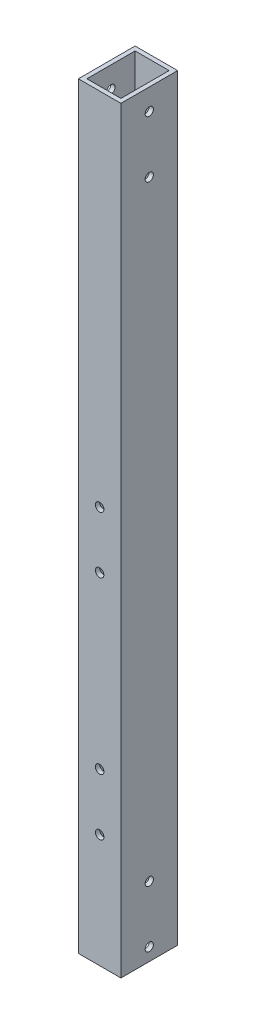
ISO-10303-21;
HEADER;
FILE_DESCRIPTION(('STEP AP214'),'2;1');
FILE_NAME('part.step','',(''),(''),'','','');
FILE_SCHEMA(('AUTOMOTIVE_DESIGN { 1 0 10303 214 1 1 1 1 }'));
ENDSEC;
DATA;
#1=APPLICATION_CONTEXT('core data for automotive mechanical design processes');
#2=APPLICATION_PROTOCOL_DEFINITION('international standard','automotive_design',2000,#1);
#3=PRODUCT_CONTEXT('',#1,'mechanical');
#4=PRODUCT('Part','Part','',(#3));
#5=PRODUCT_RELATED_PRODUCT_CATEGORY('part','',(#4));
#6=PRODUCT_DEFINITION_FORMATION('','',#4);
#7=PRODUCT_DEFINITION_CONTEXT('part definition',#1,'design');
#8=PRODUCT_DEFINITION('design','',#6,#7);
#9=PRODUCT_DEFINITION_SHAPE('','',#8);
#10=(LENGTH_UNIT() NAMED_UNIT(*) SI_UNIT(.MILLI.,.METRE.));
#11=(NAMED_UNIT(*) PLANE_ANGLE_UNIT() SI_UNIT($,.RADIAN.));
#12=(NAMED_UNIT(*) SI_UNIT($,.STERADIAN.) SOLID_ANGLE_UNIT());
#13=UNCERTAINTY_MEASURE_WITH_UNIT(LENGTH_MEASURE(1.E-05),#10,'distance_accuracy_value','');
#14=(GEOMETRIC_REPRESENTATION_CONTEXT(3) GLOBAL_UNCERTAINTY_ASSIGNED_CONTEXT((#13)) GLOBAL_UNIT_ASSIGNED_CONTEXT((#10,
#11,#12)) REPRESENTATION_CONTEXT('',''));
#15=CARTESIAN_POINT('',(0.,0.,0.));
#16=DIRECTION('',(0.,0.,1.));
#17=DIRECTION('',(1.,0.,0.));
#18=AXIS2_PLACEMENT_3D('',#15,#16,#17);
#19=CARTESIAN_POINT('',(0.,267.,0.));
#20=DIRECTION('',(0.,1.,0.));
#21=DIRECTION('',(0.,0.,1.));
#22=AXIS2_PLACEMENT_3D('',#19,#20,#21);
#23=PLANE('',#22);
#24=DIRECTION('',(0.,0.,-1.));
#25=VECTOR('',#24,1.);
#26=CARTESIAN_POINT('',(7.5,267.,10.));
#27=LINE('',#26,#25);
#28=CARTESIAN_POINT('',(7.5,267.,10.));
#29=VERTEX_POINT('',#28);
#30=CARTESIAN_POINT('',(7.5,267.,-10.));
#31=VERTEX_POINT('',#30);
#32=EDGE_CURVE('E172',#29,#31,#27,.T.);
#33=ORIENTED_EDGE('',*,*,#32,.T.);
#34=DIRECTION('',(-1.,0.,0.));
#35=VECTOR('',#34,1.);
#36=CARTESIAN_POINT('',(-7.5,267.,-10.));
#37=LINE('',#36,#35);
#38=CARTESIAN_POINT('',(-7.5,267.,-10.));
#39=VERTEX_POINT('',#38);
#40=EDGE_CURVE('E175',#31,#39,#37,.T.);
#41=ORIENTED_EDGE('',*,*,#40,.T.);
#42=DIRECTION('',(0.,0.,1.));
#43=VECTOR('',#42,1.);
#44=CARTESIAN_POINT('',(-7.5,267.,10.));
#45=LINE('',#44,#43);
#46=CARTESIAN_POINT('',(-7.5,267.,10.));
#47=VERTEX_POINT('',#46);
#48=EDGE_CURVE('E178',#39,#47,#45,.T.);
#49=ORIENTED_EDGE('',*,*,#48,.T.);
#50=DIRECTION('',(1.,0.,0.));
#51=VECTOR('',#50,1.);
#52=CARTESIAN_POINT('',(-7.5,267.,10.));
#53=LINE('',#52,#51);
#54=EDGE_CURVE('E180',#47,#29,#53,.T.);
#55=ORIENTED_EDGE('',*,*,#54,.T.);
#56=EDGE_LOOP('',(#33,#41,#49,#55));
#57=FACE_BOUND('',#56,.T.);
#58=DIRECTION('',(-1.,0.,0.));
#59=VECTOR('',#58,1.);
#60=CARTESIAN_POINT('',(0.,267.,-8.5));
#61=LINE('',#60,#59);
#62=CARTESIAN_POINT('',(6.,267.,-8.5));
#63=VERTEX_POINT('',#62);
#64=CARTESIAN_POINT('',(-6.,267.,-8.5));
#65=VERTEX_POINT('',#64);
#66=EDGE_CURVE('E142',#63,#65,#61,.T.);
#67=ORIENTED_EDGE('',*,*,#66,.F.);
#68=DIRECTION('',(0.,0.,-1.));
#69=VECTOR('',#68,1.);
#70=CARTESIAN_POINT('',(6.,267.,0.));
#71=LINE('',#70,#69);
#72=CARTESIAN_POINT('',(6.,267.,8.5));
#73=VERTEX_POINT('',#72);
#74=EDGE_CURVE('E134',#73,#63,#71,.T.);
#75=ORIENTED_EDGE('',*,*,#74,.F.);
#76=DIRECTION('',(1.,0.,0.));
#77=VECTOR('',#76,1.);
#78=CARTESIAN_POINT('',(0.,267.,8.5));
#79=LINE('',#78,#77);
#80=CARTESIAN_POINT('',(-6.,267.,8.5));
#81=VERTEX_POINT('',#80);
#82=EDGE_CURVE('E156',#81,#73,#79,.T.);
#83=ORIENTED_EDGE('',*,*,#82,.F.);
#84=DIRECTION('',(0.,0.,1.));
#85=VECTOR('',#84,1.);
#86=CARTESIAN_POINT('',(-6.,267.,0.));
#87=LINE('',#86,#85);
#88=EDGE_CURVE('E154',#65,#81,#87,.T.);
#89=ORIENTED_EDGE('',*,*,#88,.F.);
#90=EDGE_LOOP('',(#67,#75,#83,#89));
#91=FACE_BOUND('',#90,.T.);
#92=ADVANCED_FACE('F67',(#57,#91),#23,.T.);
#93=CARTESIAN_POINT('',(0.,0.,0.));
#94=DIRECTION('',(0.,1.,0.));
#95=DIRECTION('',(0.,0.,1.));
#96=AXIS2_PLACEMENT_3D('',#93,#94,#95);
#97=PLANE('',#96);
#98=DIRECTION('',(0.,0.,-1.));
#99=VECTOR('',#98,1.);
#100=CARTESIAN_POINT('',(7.5,0.,10.));
#101=LINE('',#100,#99);
#102=CARTESIAN_POINT('',(7.5,0.,10.));
#103=VERTEX_POINT('',#102);
#104=CARTESIAN_POINT('',(7.5,0.,-10.));
#105=VERTEX_POINT('',#104);
#106=EDGE_CURVE('E150',#103,#105,#101,.T.);
#107=ORIENTED_EDGE('',*,*,#106,.F.);
#108=DIRECTION('',(1.,0.,0.));
#109=VECTOR('',#108,1.);
#110=CARTESIAN_POINT('',(-7.5,0.,10.));
#111=LINE('',#110,#109);
#112=CARTESIAN_POINT('',(-7.5,0.,10.));
#113=VERTEX_POINT('',#112);
#114=EDGE_CURVE('E176',#113,#103,#111,.T.);
#115=ORIENTED_EDGE('',*,*,#114,.F.);
#116=DIRECTION('',(0.,0.,1.));
#117=VECTOR('',#116,1.);
#118=CARTESIAN_POINT('',(-7.5,0.,10.));
#119=LINE('',#118,#117);
#120=CARTESIAN_POINT('',(-7.5,0.,-10.));
#121=VERTEX_POINT('',#120);
#122=EDGE_CURVE('E187',#121,#113,#119,.T.);
#123=ORIENTED_EDGE('',*,*,#122,.F.);
#124=DIRECTION('',(-1.,0.,0.));
#125=VECTOR('',#124,1.);
#126=CARTESIAN_POINT('',(-7.5,0.,-10.));
#127=LINE('',#126,#125);
#128=EDGE_CURVE('E185',#105,#121,#127,.T.);
#129=ORIENTED_EDGE('',*,*,#128,.F.);
#130=EDGE_LOOP('',(#107,#115,#123,#129));
#131=FACE_BOUND('',#130,.T.);
#132=DIRECTION('',(0.,0.,-1.));
#133=VECTOR('',#132,1.);
#134=CARTESIAN_POINT('',(6.,0.,0.));
#135=LINE('',#134,#133);
#136=CARTESIAN_POINT('',(6.,0.,8.5));
#137=VERTEX_POINT('',#136);
#138=CARTESIAN_POINT('',(6.,0.,-8.5));
#139=VERTEX_POINT('',#138);
#140=EDGE_CURVE('E92',#137,#139,#135,.T.);
#141=ORIENTED_EDGE('',*,*,#140,.T.);
#142=DIRECTION('',(-1.,0.,0.));
#143=VECTOR('',#142,1.);
#144=CARTESIAN_POINT('',(0.,0.,-8.5));
#145=LINE('',#144,#143);
#146=CARTESIAN_POINT('',(-6.,0.,-8.5));
#147=VERTEX_POINT('',#146);
#148=EDGE_CURVE('E149',#139,#147,#145,.T.);
#149=ORIENTED_EDGE('',*,*,#148,.T.);
#150=DIRECTION('',(0.,0.,1.));
#151=VECTOR('',#150,1.);
#152=CARTESIAN_POINT('',(-6.,0.,0.));
#153=LINE('',#152,#151);
#154=CARTESIAN_POINT('',(-6.,0.,8.5));
#155=VERTEX_POINT('',#154);
#156=EDGE_CURVE('E164',#147,#155,#153,.T.);
#157=ORIENTED_EDGE('',*,*,#156,.T.);
#158=DIRECTION('',(1.,0.,0.));
#159=VECTOR('',#158,1.);
#160=CARTESIAN_POINT('',(0.,0.,8.5));
#161=LINE('',#160,#159);
#162=EDGE_CURVE('E143',#155,#137,#161,.T.);
#163=ORIENTED_EDGE('',*,*,#162,.T.);
#164=EDGE_LOOP('',(#141,#149,#157,#163));
#165=FACE_BOUND('',#164,.T.);
#166=ADVANCED_FACE('F294',(#131,#165),#97,.F.);
#167=CARTESIAN_POINT('',(7.5,267.,10.));
#168=DIRECTION('',(-1.,0.,0.));
#169=DIRECTION('',(0.,0.,1.));
#170=AXIS2_PLACEMENT_3D('',#167,#168,#169);
#171=PLANE('',#170);
#172=CARTESIAN_POINT('',(7.5,259.5,0.));
#173=DIRECTION('',(1.,0.,0.));
#174=DIRECTION('',(0.,0.,-1.));
#175=AXIS2_PLACEMENT_3D('',#172,#173,#174);
#176=CIRCLE('',#175,1.44999999999999);
#177=CARTESIAN_POINT('',(7.5,259.5,-1.44999999999999));
#178=VERTEX_POINT('',#177);
#179=EDGE_CURVE('E241',#178,#178,#176,.T.);
#180=ORIENTED_EDGE('',*,*,#179,.F.);
#181=EDGE_LOOP('',(#180));
#182=FACE_BOUND('',#181,.T.);
#183=CARTESIAN_POINT('',(7.5,239.5,0.));
#184=DIRECTION('',(1.,0.,0.));
#185=DIRECTION('',(0.,0.,-1.));
#186=AXIS2_PLACEMENT_3D('',#183,#184,#185);
#187=CIRCLE('',#186,1.45);
#188=CARTESIAN_POINT('',(7.5,239.5,-1.45));
#189=VERTEX_POINT('',#188);
#190=EDGE_CURVE('E244',#189,#189,#187,.T.);
#191=ORIENTED_EDGE('',*,*,#190,.F.);
#192=EDGE_LOOP('',(#191));
#193=FACE_BOUND('',#192,.T.);
#194=CARTESIAN_POINT('',(7.5,24.5,0.));
#195=DIRECTION('',(1.,0.,0.));
#196=DIRECTION('',(0.,0.,-1.));
#197=AXIS2_PLACEMENT_3D('',#194,#195,#196);
#198=CIRCLE('',#197,1.45);
#199=CARTESIAN_POINT('',(7.5,24.5,-1.45));
#200=VERTEX_POINT('',#199);
#201=EDGE_CURVE('E250',#200,#200,#198,.T.);
#202=ORIENTED_EDGE('',*,*,#201,.F.);
#203=EDGE_LOOP('',(#202));
#204=FACE_BOUND('',#203,.T.);
#205=CARTESIAN_POINT('',(7.5,4.5,0.));
#206=DIRECTION('',(1.,0.,0.));
#207=DIRECTION('',(0.,0.,-1.));
#208=AXIS2_PLACEMENT_3D('',#205,#206,#207);
#209=CIRCLE('',#208,1.45);
#210=CARTESIAN_POINT('',(7.5,4.5,-1.45));
#211=VERTEX_POINT('',#210);
#212=EDGE_CURVE('E256',#211,#211,#209,.T.);
#213=ORIENTED_EDGE('',*,*,#212,.F.);
#214=EDGE_LOOP('',(#213));
#215=FACE_BOUND('',#214,.T.);
#216=ORIENTED_EDGE('',*,*,#106,.T.);
#217=DIRECTION('',(0.,-1.,0.));
#218=VECTOR('',#217,1.);
#219=CARTESIAN_POINT('',(7.5,267.,-10.));
#220=LINE('',#219,#218);
#221=EDGE_CURVE('E12',#31,#105,#220,.T.);
#222=ORIENTED_EDGE('',*,*,#221,.F.);
#223=ORIENTED_EDGE('',*,*,#32,.F.);
#224=DIRECTION('',(0.,-1.,0.));
#225=VECTOR('',#224,1.);
#226=CARTESIAN_POINT('',(7.5,267.,10.));
#227=LINE('',#226,#225);
#228=EDGE_CURVE('E182',#29,#103,#227,.T.);
#229=ORIENTED_EDGE('',*,*,#228,.T.);
#230=EDGE_LOOP('',(#216,#222,#223,#229));
#231=FACE_BOUND('',#230,.T.);
#232=ADVANCED_FACE('F69',(#182,#193,#204,#215,#231),#171,.F.);
#233=CARTESIAN_POINT('',(-7.5,267.,-10.));
#234=DIRECTION('',(0.,0.,1.));
#235=DIRECTION('',(1.,0.,0.));
#236=AXIS2_PLACEMENT_3D('',#233,#234,#235);
#237=PLANE('',#236);
#238=CARTESIAN_POINT('',(0.,40.,-10.));
#239=DIRECTION('',(0.,0.,1.));
#240=DIRECTION('',(1.,0.,0.));
#241=AXIS2_PLACEMENT_3D('',#238,#239,#240);
#242=CIRCLE('',#241,1.5);
#243=CARTESIAN_POINT('',(1.5,40.,-10.));
#244=VERTEX_POINT('',#243);
#245=EDGE_CURVE('E217',#244,#244,#242,.T.);
#246=ORIENTED_EDGE('',*,*,#245,.T.);
#247=EDGE_LOOP('',(#246));
#248=FACE_BOUND('',#247,.T.);
#249=CARTESIAN_POINT('',(0.,60.,-10.));
#250=DIRECTION('',(0.,0.,1.));
#251=DIRECTION('',(1.,0.,0.));
#252=AXIS2_PLACEMENT_3D('',#249,#250,#251);
#253=CIRCLE('',#252,1.5);
#254=CARTESIAN_POINT('',(1.5,60.,-10.));
#255=VERTEX_POINT('',#254);
#256=EDGE_CURVE('E398',#255,#255,#253,.T.);
#257=ORIENTED_EDGE('',*,*,#256,.T.);
#258=EDGE_LOOP('',(#257));
#259=FACE_BOUND('',#258,.T.);
#260=CARTESIAN_POINT('',(0.,120.,-10.));
#261=DIRECTION('',(0.,0.,1.));
#262=DIRECTION('',(1.,0.,0.));
#263=AXIS2_PLACEMENT_3D('',#260,#261,#262);
#264=CIRCLE('',#263,1.5);
#265=CARTESIAN_POINT('',(1.5,120.,-10.));
#266=VERTEX_POINT('',#265);
#267=EDGE_CURVE('E404',#266,#266,#264,.T.);
#268=ORIENTED_EDGE('',*,*,#267,.T.);
#269=EDGE_LOOP('',(#268));
#270=FACE_BOUND('',#269,.T.);
#271=CARTESIAN_POINT('',(0.,140.,-10.));
#272=DIRECTION('',(0.,0.,1.));
#273=DIRECTION('',(1.,0.,0.));
#274=AXIS2_PLACEMENT_3D('',#271,#272,#273);
#275=CIRCLE('',#274,1.5);
#276=CARTESIAN_POINT('',(1.5,140.,-10.));
#277=VERTEX_POINT('',#276);
#278=EDGE_CURVE('E409',#277,#277,#275,.T.);
#279=ORIENTED_EDGE('',*,*,#278,.T.);
#280=EDGE_LOOP('',(#279));
#281=FACE_BOUND('',#280,.T.);
#282=ORIENTED_EDGE('',*,*,#128,.T.);
#283=DIRECTION('',(0.,-1.,0.));
#284=VECTOR('',#283,1.);
#285=CARTESIAN_POINT('',(-7.5,267.,-10.));
#286=LINE('',#285,#284);
#287=EDGE_CURVE('E76',#39,#121,#286,.T.);
#288=ORIENTED_EDGE('',*,*,#287,.F.);
#289=ORIENTED_EDGE('',*,*,#40,.F.);
#290=ORIENTED_EDGE('',*,*,#221,.T.);
#291=EDGE_LOOP('',(#282,#288,#289,#290));
#292=FACE_BOUND('',#291,.T.);
#293=ADVANCED_FACE('F293',(#248,#259,#270,#281,#292),#237,.F.);
#294=CARTESIAN_POINT('',(-7.5,267.,10.));
#295=DIRECTION('',(1.,0.,0.));
#296=DIRECTION('',(0.,0.,-1.));
#297=AXIS2_PLACEMENT_3D('',#294,#295,#296);
#298=PLANE('',#297);
#299=CARTESIAN_POINT('',(-7.5,259.5,0.));
#300=DIRECTION('',(1.,0.,0.));
#301=DIRECTION('',(0.,0.,-1.));
#302=AXIS2_PLACEMENT_3D('',#299,#300,#301);
#303=CIRCLE('',#302,1.44999999999999);
#304=CARTESIAN_POINT('',(-7.5,259.5,-1.44999999999999));
#305=VERTEX_POINT('',#304);
#306=EDGE_CURVE('E201',#305,#305,#303,.T.);
#307=ORIENTED_EDGE('',*,*,#306,.T.);
#308=EDGE_LOOP('',(#307));
#309=FACE_BOUND('',#308,.T.);
#310=CARTESIAN_POINT('',(-7.5,239.5,0.));
#311=DIRECTION('',(1.,0.,0.));
#312=DIRECTION('',(0.,0.,-1.));
#313=AXIS2_PLACEMENT_3D('',#310,#311,#312);
#314=CIRCLE('',#313,1.45);
#315=CARTESIAN_POINT('',(-7.5,239.5,-1.45));
#316=VERTEX_POINT('',#315);
#317=EDGE_CURVE('E247',#316,#316,#314,.T.);
#318=ORIENTED_EDGE('',*,*,#317,.T.);
#319=EDGE_LOOP('',(#318));
#320=FACE_BOUND('',#319,.T.);
#321=CARTESIAN_POINT('',(-7.5,24.5,0.));
#322=DIRECTION('',(1.,0.,0.));
#323=DIRECTION('',(0.,0.,-1.));
#324=AXIS2_PLACEMENT_3D('',#321,#322,#323);
#325=CIRCLE('',#324,1.45);
#326=CARTESIAN_POINT('',(-7.5,24.5,-1.45));
#327=VERTEX_POINT('',#326);
#328=EDGE_CURVE('E253',#327,#327,#325,.T.);
#329=ORIENTED_EDGE('',*,*,#328,.T.);
#330=EDGE_LOOP('',(#329));
#331=FACE_BOUND('',#330,.T.);
#332=CARTESIAN_POINT('',(-7.5,4.5,0.));
#333=DIRECTION('',(1.,0.,0.));
#334=DIRECTION('',(0.,0.,-1.));
#335=AXIS2_PLACEMENT_3D('',#332,#333,#334);
#336=CIRCLE('',#335,1.45);
#337=CARTESIAN_POINT('',(-7.5,4.5,-1.45));
#338=VERTEX_POINT('',#337);
#339=EDGE_CURVE('E238',#338,#338,#336,.T.);
#340=ORIENTED_EDGE('',*,*,#339,.T.);
#341=EDGE_LOOP('',(#340));
#342=FACE_BOUND('',#341,.T.);
#343=ORIENTED_EDGE('',*,*,#122,.T.);
#344=DIRECTION('',(0.,-1.,0.));
#345=VECTOR('',#344,1.);
#346=CARTESIAN_POINT('',(-7.5,267.,10.));
#347=LINE('',#346,#345);
#348=EDGE_CURVE('E192',#47,#113,#347,.T.);
#349=ORIENTED_EDGE('',*,*,#348,.F.);
#350=ORIENTED_EDGE('',*,*,#48,.F.);
#351=ORIENTED_EDGE('',*,*,#287,.T.);
#352=EDGE_LOOP('',(#343,#349,#350,#351));
#353=FACE_BOUND('',#352,.T.);
#354=ADVANCED_FACE('F312',(#309,#320,#331,#342,#353),#298,.F.);
#355=CARTESIAN_POINT('',(-7.5,267.,10.));
#356=DIRECTION('',(0.,0.,-1.));
#357=DIRECTION('',(-1.,0.,0.));
#358=AXIS2_PLACEMENT_3D('',#355,#356,#357);
#359=PLANE('',#358);
#360=CARTESIAN_POINT('',(0.,40.,10.));
#361=DIRECTION('',(0.,0.,1.));
#362=DIRECTION('',(1.,0.,0.));
#363=AXIS2_PLACEMENT_3D('',#360,#361,#362);
#364=CIRCLE('',#363,1.5);
#365=CARTESIAN_POINT('',(1.5,40.,10.));
#366=VERTEX_POINT('',#365);
#367=EDGE_CURVE('E390',#366,#366,#364,.T.);
#368=ORIENTED_EDGE('',*,*,#367,.F.);
#369=EDGE_LOOP('',(#368));
#370=FACE_BOUND('',#369,.T.);
#371=CARTESIAN_POINT('',(0.,60.,10.));
#372=DIRECTION('',(0.,0.,1.));
#373=DIRECTION('',(1.,0.,0.));
#374=AXIS2_PLACEMENT_3D('',#371,#372,#373);
#375=CIRCLE('',#374,1.5);
#376=CARTESIAN_POINT('',(1.5,60.,10.));
#377=VERTEX_POINT('',#376);
#378=EDGE_CURVE('E393',#377,#377,#375,.T.);
#379=ORIENTED_EDGE('',*,*,#378,.F.);
#380=EDGE_LOOP('',(#379));
#381=FACE_BOUND('',#380,.T.);
#382=CARTESIAN_POINT('',(0.,120.,10.));
#383=DIRECTION('',(0.,0.,1.));
#384=DIRECTION('',(1.,0.,0.));
#385=AXIS2_PLACEMENT_3D('',#382,#383,#384);
#386=CIRCLE('',#385,1.5);
#387=CARTESIAN_POINT('',(1.5,120.,10.));
#388=VERTEX_POINT('',#387);
#389=EDGE_CURVE('E401',#388,#388,#386,.T.);
#390=ORIENTED_EDGE('',*,*,#389,.F.);
#391=EDGE_LOOP('',(#390));
#392=FACE_BOUND('',#391,.T.);
#393=CARTESIAN_POINT('',(0.,140.,10.));
#394=DIRECTION('',(0.,0.,1.));
#395=DIRECTION('',(1.,0.,0.));
#396=AXIS2_PLACEMENT_3D('',#393,#394,#395);
#397=CIRCLE('',#396,1.5);
#398=CARTESIAN_POINT('',(1.5,140.,10.));
#399=VERTEX_POINT('',#398);
#400=EDGE_CURVE('E407',#399,#399,#397,.T.);
#401=ORIENTED_EDGE('',*,*,#400,.F.);
#402=EDGE_LOOP('',(#401));
#403=FACE_BOUND('',#402,.T.);
#404=ORIENTED_EDGE('',*,*,#114,.T.);
#405=ORIENTED_EDGE('',*,*,#228,.F.);
#406=ORIENTED_EDGE('',*,*,#54,.F.);
#407=ORIENTED_EDGE('',*,*,#348,.T.);
#408=EDGE_LOOP('',(#404,#405,#406,#407));
#409=FACE_BOUND('',#408,.T.);
#410=ADVANCED_FACE('F274',(#370,#381,#392,#403,#409),#359,.F.);
#411=CARTESIAN_POINT('',(6.,267.,0.));
#412=DIRECTION('',(-1.,0.,0.));
#413=DIRECTION('',(0.,0.,1.));
#414=AXIS2_PLACEMENT_3D('',#411,#412,#413);
#415=PLANE('',#414);
#416=CARTESIAN_POINT('',(6.,259.5,0.));
#417=DIRECTION('',(-1.,0.,0.));
#418=DIRECTION('',(0.,0.,1.));
#419=AXIS2_PLACEMENT_3D('',#416,#417,#418);
#420=CIRCLE('',#419,1.44999999999999);
#421=CARTESIAN_POINT('',(6.,259.5,1.44999999999999));
#422=VERTEX_POINT('',#421);
#423=EDGE_CURVE('E162',#422,#422,#420,.T.);
#424=ORIENTED_EDGE('',*,*,#423,.F.);
#425=EDGE_LOOP('',(#424));
#426=FACE_BOUND('',#425,.T.);
#427=CARTESIAN_POINT('',(6.,239.5,0.));
#428=DIRECTION('',(-1.,0.,0.));
#429=DIRECTION('',(0.,0.,1.));
#430=AXIS2_PLACEMENT_3D('',#427,#428,#429);
#431=CIRCLE('',#430,1.45);
#432=CARTESIAN_POINT('',(6.,239.5,1.45));
#433=VERTEX_POINT('',#432);
#434=EDGE_CURVE('E209',#433,#433,#431,.T.);
#435=ORIENTED_EDGE('',*,*,#434,.F.);
#436=EDGE_LOOP('',(#435));
#437=FACE_BOUND('',#436,.T.);
#438=CARTESIAN_POINT('',(6.,24.5,0.));
#439=DIRECTION('',(-1.,0.,0.));
#440=DIRECTION('',(0.,0.,1.));
#441=AXIS2_PLACEMENT_3D('',#438,#439,#440);
#442=CIRCLE('',#441,1.45);
#443=CARTESIAN_POINT('',(6.,24.5,1.45));
#444=VERTEX_POINT('',#443);
#445=EDGE_CURVE('E205',#444,#444,#442,.T.);
#446=ORIENTED_EDGE('',*,*,#445,.F.);
#447=EDGE_LOOP('',(#446));
#448=FACE_BOUND('',#447,.T.);
#449=CARTESIAN_POINT('',(6.,4.5,0.));
#450=DIRECTION('',(-1.,0.,0.));
#451=DIRECTION('',(0.,0.,1.));
#452=AXIS2_PLACEMENT_3D('',#449,#450,#451);
#453=CIRCLE('',#452,1.45);
#454=CARTESIAN_POINT('',(6.,4.5,1.45));
#455=VERTEX_POINT('',#454);
#456=EDGE_CURVE('E200',#455,#455,#453,.T.);
#457=ORIENTED_EDGE('',*,*,#456,.F.);
#458=EDGE_LOOP('',(#457));
#459=FACE_BOUND('',#458,.T.);
#460=ORIENTED_EDGE('',*,*,#140,.F.);
#461=DIRECTION('',(0.,-1.,0.));
#462=VECTOR('',#461,1.);
#463=CARTESIAN_POINT('',(6.,267.,8.5));
#464=LINE('',#463,#462);
#465=EDGE_CURVE('E138',#73,#137,#464,.T.);
#466=ORIENTED_EDGE('',*,*,#465,.F.);
#467=ORIENTED_EDGE('',*,*,#74,.T.);
#468=DIRECTION('',(0.,-1.,0.));
#469=VECTOR('',#468,1.);
#470=CARTESIAN_POINT('',(6.,267.,-8.5));
#471=LINE('',#470,#469);
#472=EDGE_CURVE('E137',#63,#139,#471,.T.);
#473=ORIENTED_EDGE('',*,*,#472,.T.);
#474=EDGE_LOOP('',(#460,#466,#467,#473));
#475=FACE_BOUND('',#474,.T.);
#476=ADVANCED_FACE('F136',(#426,#437,#448,#459,#475),#415,.T.);
#477=CARTESIAN_POINT('',(0.,267.,-8.5));
#478=DIRECTION('',(0.,0.,1.));
#479=DIRECTION('',(1.,0.,0.));
#480=AXIS2_PLACEMENT_3D('',#477,#478,#479);
#481=PLANE('',#480);
#482=CARTESIAN_POINT('',(0.,40.,-8.5));
#483=DIRECTION('',(0.,0.,1.));
#484=DIRECTION('',(1.,0.,0.));
#485=AXIS2_PLACEMENT_3D('',#482,#483,#484);
#486=CIRCLE('',#485,1.5);
#487=CARTESIAN_POINT('',(1.5,40.,-8.5));
#488=VERTEX_POINT('',#487);
#489=EDGE_CURVE('E235',#488,#488,#486,.T.);
#490=ORIENTED_EDGE('',*,*,#489,.F.);
#491=EDGE_LOOP('',(#490));
#492=FACE_BOUND('',#491,.T.);
#493=CARTESIAN_POINT('',(0.,60.,-8.5));
#494=DIRECTION('',(0.,0.,1.));
#495=DIRECTION('',(1.,0.,0.));
#496=AXIS2_PLACEMENT_3D('',#493,#494,#495);
#497=CIRCLE('',#496,1.5);
#498=CARTESIAN_POINT('',(1.5,60.,-8.5));
#499=VERTEX_POINT('',#498);
#500=EDGE_CURVE('E223',#499,#499,#497,.T.);
#501=ORIENTED_EDGE('',*,*,#500,.F.);
#502=EDGE_LOOP('',(#501));
#503=FACE_BOUND('',#502,.T.);
#504=CARTESIAN_POINT('',(0.,120.,-8.5));
#505=DIRECTION('',(0.,0.,1.));
#506=DIRECTION('',(1.,0.,0.));
#507=AXIS2_PLACEMENT_3D('',#504,#505,#506);
#508=CIRCLE('',#507,1.5);
#509=CARTESIAN_POINT('',(1.5,120.,-8.5));
#510=VERTEX_POINT('',#509);
#511=EDGE_CURVE('E220',#510,#510,#508,.T.);
#512=ORIENTED_EDGE('',*,*,#511,.F.);
#513=EDGE_LOOP('',(#512));
#514=FACE_BOUND('',#513,.T.);
#515=CARTESIAN_POINT('',(0.,140.,-8.5));
#516=DIRECTION('',(0.,0.,1.));
#517=DIRECTION('',(1.,0.,0.));
#518=AXIS2_PLACEMENT_3D('',#515,#516,#517);
#519=CIRCLE('',#518,1.5);
#520=CARTESIAN_POINT('',(1.5,140.,-8.5));
#521=VERTEX_POINT('',#520);
#522=EDGE_CURVE('E216',#521,#521,#519,.T.);
#523=ORIENTED_EDGE('',*,*,#522,.F.);
#524=EDGE_LOOP('',(#523));
#525=FACE_BOUND('',#524,.T.);
#526=ORIENTED_EDGE('',*,*,#148,.F.);
#527=ORIENTED_EDGE('',*,*,#472,.F.);
#528=ORIENTED_EDGE('',*,*,#66,.T.);
#529=DIRECTION('',(0.,-1.,0.));
#530=VECTOR('',#529,1.);
#531=CARTESIAN_POINT('',(-6.,267.,-8.5));
#532=LINE('',#531,#530);
#533=EDGE_CURVE('E151',#65,#147,#532,.T.);
#534=ORIENTED_EDGE('',*,*,#533,.T.);
#535=EDGE_LOOP('',(#526,#527,#528,#534));
#536=FACE_BOUND('',#535,.T.);
#537=ADVANCED_FACE('F146',(#492,#503,#514,#525,#536),#481,.T.);
#538=CARTESIAN_POINT('',(-6.,267.,0.));
#539=DIRECTION('',(1.,0.,0.));
#540=DIRECTION('',(0.,0.,-1.));
#541=AXIS2_PLACEMENT_3D('',#538,#539,#540);
#542=PLANE('',#541);
#543=CARTESIAN_POINT('',(-6.,259.5,0.));
#544=DIRECTION('',(1.,0.,0.));
#545=DIRECTION('',(0.,0.,-1.));
#546=AXIS2_PLACEMENT_3D('',#543,#544,#545);
#547=CIRCLE('',#546,1.44999999999999);
#548=CARTESIAN_POINT('',(-6.,259.5,-1.44999999999999));
#549=VERTEX_POINT('',#548);
#550=EDGE_CURVE('E210',#549,#549,#547,.T.);
#551=ORIENTED_EDGE('',*,*,#550,.F.);
#552=EDGE_LOOP('',(#551));
#553=FACE_BOUND('',#552,.T.);
#554=CARTESIAN_POINT('',(-6.,239.5,0.));
#555=DIRECTION('',(1.,0.,0.));
#556=DIRECTION('',(0.,0.,-1.));
#557=AXIS2_PLACEMENT_3D('',#554,#555,#556);
#558=CIRCLE('',#557,1.45);
#559=CARTESIAN_POINT('',(-6.,239.5,-1.45));
#560=VERTEX_POINT('',#559);
#561=EDGE_CURVE('E206',#560,#560,#558,.T.);
#562=ORIENTED_EDGE('',*,*,#561,.F.);
#563=EDGE_LOOP('',(#562));
#564=FACE_BOUND('',#563,.T.);
#565=CARTESIAN_POINT('',(-6.,24.5,0.));
#566=DIRECTION('',(1.,0.,0.));
#567=DIRECTION('',(0.,0.,-1.));
#568=AXIS2_PLACEMENT_3D('',#565,#566,#567);
#569=CIRCLE('',#568,1.45);
#570=CARTESIAN_POINT('',(-6.,24.5,-1.45));
#571=VERTEX_POINT('',#570);
#572=EDGE_CURVE('E202',#571,#571,#569,.T.);
#573=ORIENTED_EDGE('',*,*,#572,.F.);
#574=EDGE_LOOP('',(#573));
#575=FACE_BOUND('',#574,.T.);
#576=CARTESIAN_POINT('',(-6.,4.5,0.));
#577=DIRECTION('',(1.,0.,0.));
#578=DIRECTION('',(0.,0.,-1.));
#579=AXIS2_PLACEMENT_3D('',#576,#577,#578);
#580=CIRCLE('',#579,1.45);
#581=CARTESIAN_POINT('',(-6.,4.5,-1.45));
#582=VERTEX_POINT('',#581);
#583=EDGE_CURVE('E197',#582,#582,#580,.T.);
#584=ORIENTED_EDGE('',*,*,#583,.F.);
#585=EDGE_LOOP('',(#584));
#586=FACE_BOUND('',#585,.T.);
#587=ORIENTED_EDGE('',*,*,#156,.F.);
#588=ORIENTED_EDGE('',*,*,#533,.F.);
#589=ORIENTED_EDGE('',*,*,#88,.T.);
#590=DIRECTION('',(0.,-1.,0.));
#591=VECTOR('',#590,1.);
#592=CARTESIAN_POINT('',(-6.,267.,8.5));
#593=LINE('',#592,#591);
#594=EDGE_CURVE('E84',#81,#155,#593,.T.);
#595=ORIENTED_EDGE('',*,*,#594,.T.);
#596=EDGE_LOOP('',(#587,#588,#589,#595));
#597=FACE_BOUND('',#596,.T.);
#598=ADVANCED_FACE('F333',(#553,#564,#575,#586,#597),#542,.T.);
#599=CARTESIAN_POINT('',(0.,267.,8.5));
#600=DIRECTION('',(0.,0.,-1.));
#601=DIRECTION('',(-1.,0.,0.));
#602=AXIS2_PLACEMENT_3D('',#599,#600,#601);
#603=PLANE('',#602);
#604=CARTESIAN_POINT('',(0.,40.,8.5));
#605=DIRECTION('',(0.,0.,-1.));
#606=DIRECTION('',(-1.,0.,0.));
#607=AXIS2_PLACEMENT_3D('',#604,#605,#606);
#608=CIRCLE('',#607,1.5);
#609=CARTESIAN_POINT('',(-1.5,40.,8.5));
#610=VERTEX_POINT('',#609);
#611=EDGE_CURVE('E71',#610,#610,#608,.T.);
#612=ORIENTED_EDGE('',*,*,#611,.F.);
#613=EDGE_LOOP('',(#612));
#614=FACE_BOUND('',#613,.T.);
#615=CARTESIAN_POINT('',(0.,60.,8.5));
#616=DIRECTION('',(0.,0.,-1.));
#617=DIRECTION('',(-1.,0.,0.));
#618=AXIS2_PLACEMENT_3D('',#615,#616,#617);
#619=CIRCLE('',#618,1.5);
#620=CARTESIAN_POINT('',(-1.5,60.,8.5));
#621=VERTEX_POINT('',#620);
#622=EDGE_CURVE('E221',#621,#621,#619,.T.);
#623=ORIENTED_EDGE('',*,*,#622,.F.);
#624=EDGE_LOOP('',(#623));
#625=FACE_BOUND('',#624,.T.);
#626=CARTESIAN_POINT('',(0.,120.,8.5));
#627=DIRECTION('',(0.,0.,-1.));
#628=DIRECTION('',(-1.,0.,0.));
#629=AXIS2_PLACEMENT_3D('',#626,#627,#628);
#630=CIRCLE('',#629,1.5);
#631=CARTESIAN_POINT('',(-1.5,120.,8.5));
#632=VERTEX_POINT('',#631);
#633=EDGE_CURVE('E218',#632,#632,#630,.T.);
#634=ORIENTED_EDGE('',*,*,#633,.F.);
#635=EDGE_LOOP('',(#634));
#636=FACE_BOUND('',#635,.T.);
#637=CARTESIAN_POINT('',(0.,140.,8.5));
#638=DIRECTION('',(0.,0.,-1.));
#639=DIRECTION('',(-1.,0.,0.));
#640=AXIS2_PLACEMENT_3D('',#637,#638,#639);
#641=CIRCLE('',#640,1.5);
#642=CARTESIAN_POINT('',(-1.5,140.,8.5));
#643=VERTEX_POINT('',#642);
#644=EDGE_CURVE('E213',#643,#643,#641,.T.);
#645=ORIENTED_EDGE('',*,*,#644,.F.);
#646=EDGE_LOOP('',(#645));
#647=FACE_BOUND('',#646,.T.);
#648=ORIENTED_EDGE('',*,*,#162,.F.);
#649=ORIENTED_EDGE('',*,*,#594,.F.);
#650=ORIENTED_EDGE('',*,*,#82,.T.);
#651=ORIENTED_EDGE('',*,*,#465,.T.);
#652=EDGE_LOOP('',(#648,#649,#650,#651));
#653=FACE_BOUND('',#652,.T.);
#654=ADVANCED_FACE('F337',(#614,#625,#636,#647,#653),#603,.T.);
#655=CARTESIAN_POINT('',(-7.5,4.5,0.));
#656=DIRECTION('',(1.,0.,0.));
#657=DIRECTION('',(0.,0.,-1.));
#658=AXIS2_PLACEMENT_3D('',#655,#656,#657);
#659=CYLINDRICAL_SURFACE('',#658,1.45);
#660=ORIENTED_EDGE('',*,*,#583,.T.);
#661=EDGE_LOOP('',(#660));
#662=FACE_BOUND('',#661,.T.);
#663=ORIENTED_EDGE('',*,*,#339,.F.);
#664=EDGE_LOOP('',(#663));
#665=FACE_BOUND('',#664,.T.);
#666=ADVANCED_FACE('F288',(#662,#665),#659,.F.);
#667=CARTESIAN_POINT('',(-7.5,24.5,0.));
#668=DIRECTION('',(1.,0.,0.));
#669=DIRECTION('',(0.,0.,-1.));
#670=AXIS2_PLACEMENT_3D('',#667,#668,#669);
#671=CYLINDRICAL_SURFACE('',#670,1.45);
#672=ORIENTED_EDGE('',*,*,#572,.T.);
#673=EDGE_LOOP('',(#672));
#674=FACE_BOUND('',#673,.T.);
#675=ORIENTED_EDGE('',*,*,#328,.F.);
#676=EDGE_LOOP('',(#675));
#677=FACE_BOUND('',#676,.T.);
#678=ADVANCED_FACE('F343',(#674,#677),#671,.F.);
#679=CARTESIAN_POINT('',(-7.5,239.5,0.));
#680=DIRECTION('',(1.,0.,0.));
#681=DIRECTION('',(0.,0.,-1.));
#682=AXIS2_PLACEMENT_3D('',#679,#680,#681);
#683=CYLINDRICAL_SURFACE('',#682,1.45);
#684=ORIENTED_EDGE('',*,*,#561,.T.);
#685=EDGE_LOOP('',(#684));
#686=FACE_BOUND('',#685,.T.);
#687=ORIENTED_EDGE('',*,*,#317,.F.);
#688=EDGE_LOOP('',(#687));
#689=FACE_BOUND('',#688,.T.);
#690=ADVANCED_FACE('F347',(#686,#689),#683,.F.);
#691=CARTESIAN_POINT('',(-7.5,259.5,0.));
#692=DIRECTION('',(1.,0.,0.));
#693=DIRECTION('',(0.,0.,-1.));
#694=AXIS2_PLACEMENT_3D('',#691,#692,#693);
#695=CYLINDRICAL_SURFACE('',#694,1.44999999999999);
#696=ORIENTED_EDGE('',*,*,#550,.T.);
#697=EDGE_LOOP('',(#696));
#698=FACE_BOUND('',#697,.T.);
#699=ORIENTED_EDGE('',*,*,#306,.F.);
#700=EDGE_LOOP('',(#699));
#701=FACE_BOUND('',#700,.T.);
#702=ADVANCED_FACE('F286',(#698,#701),#695,.F.);
#703=ORIENTED_EDGE('',*,*,#456,.T.);
#704=EDGE_LOOP('',(#703));
#705=FACE_BOUND('',#704,.T.);
#706=ORIENTED_EDGE('',*,*,#212,.T.);
#707=EDGE_LOOP('',(#706));
#708=FACE_BOUND('',#707,.T.);
#709=ADVANCED_FACE('F282',(#705,#708),#659,.F.);
#710=ORIENTED_EDGE('',*,*,#445,.T.);
#711=EDGE_LOOP('',(#710));
#712=FACE_BOUND('',#711,.T.);
#713=ORIENTED_EDGE('',*,*,#201,.T.);
#714=EDGE_LOOP('',(#713));
#715=FACE_BOUND('',#714,.T.);
#716=ADVANCED_FACE('F285',(#712,#715),#671,.F.);
#717=ORIENTED_EDGE('',*,*,#434,.T.);
#718=EDGE_LOOP('',(#717));
#719=FACE_BOUND('',#718,.T.);
#720=ORIENTED_EDGE('',*,*,#190,.T.);
#721=EDGE_LOOP('',(#720));
#722=FACE_BOUND('',#721,.T.);
#723=ADVANCED_FACE('F352',(#719,#722),#683,.F.);
#724=ORIENTED_EDGE('',*,*,#423,.T.);
#725=EDGE_LOOP('',(#724));
#726=FACE_BOUND('',#725,.T.);
#727=ORIENTED_EDGE('',*,*,#179,.T.);
#728=EDGE_LOOP('',(#727));
#729=FACE_BOUND('',#728,.T.);
#730=ADVANCED_FACE('F269',(#726,#729),#695,.F.);
#731=CARTESIAN_POINT('',(0.,140.,-10.));
#732=DIRECTION('',(0.,0.,1.));
#733=DIRECTION('',(1.,0.,0.));
#734=AXIS2_PLACEMENT_3D('',#731,#732,#733);
#735=CYLINDRICAL_SURFACE('',#734,1.5);
#736=ORIENTED_EDGE('',*,*,#644,.T.);
#737=EDGE_LOOP('',(#736));
#738=FACE_BOUND('',#737,.T.);
#739=ORIENTED_EDGE('',*,*,#400,.T.);
#740=EDGE_LOOP('',(#739));
#741=FACE_BOUND('',#740,.T.);
#742=ADVANCED_FACE('F356',(#738,#741),#735,.F.);
#743=CARTESIAN_POINT('',(0.,120.,-10.));
#744=DIRECTION('',(0.,0.,1.));
#745=DIRECTION('',(1.,0.,0.));
#746=AXIS2_PLACEMENT_3D('',#743,#744,#745);
#747=CYLINDRICAL_SURFACE('',#746,1.5);
#748=ORIENTED_EDGE('',*,*,#633,.T.);
#749=EDGE_LOOP('',(#748));
#750=FACE_BOUND('',#749,.T.);
#751=ORIENTED_EDGE('',*,*,#389,.T.);
#752=EDGE_LOOP('',(#751));
#753=FACE_BOUND('',#752,.T.);
#754=ADVANCED_FACE('F359',(#750,#753),#747,.F.);
#755=CARTESIAN_POINT('',(0.,60.,-10.));
#756=DIRECTION('',(0.,0.,1.));
#757=DIRECTION('',(1.,0.,0.));
#758=AXIS2_PLACEMENT_3D('',#755,#756,#757);
#759=CYLINDRICAL_SURFACE('',#758,1.5);
#760=ORIENTED_EDGE('',*,*,#622,.T.);
#761=EDGE_LOOP('',(#760));
#762=FACE_BOUND('',#761,.T.);
#763=ORIENTED_EDGE('',*,*,#378,.T.);
#764=EDGE_LOOP('',(#763));
#765=FACE_BOUND('',#764,.T.);
#766=ADVANCED_FACE('F364',(#762,#765),#759,.F.);
#767=CARTESIAN_POINT('',(0.,40.,-10.));
#768=DIRECTION('',(0.,0.,1.));
#769=DIRECTION('',(1.,0.,0.));
#770=AXIS2_PLACEMENT_3D('',#767,#768,#769);
#771=CYLINDRICAL_SURFACE('',#770,1.5);
#772=ORIENTED_EDGE('',*,*,#611,.T.);
#773=EDGE_LOOP('',(#772));
#774=FACE_BOUND('',#773,.T.);
#775=ORIENTED_EDGE('',*,*,#367,.T.);
#776=EDGE_LOOP('',(#775));
#777=FACE_BOUND('',#776,.T.);
#778=ADVANCED_FACE('F369',(#774,#777),#771,.F.);
#779=ORIENTED_EDGE('',*,*,#522,.T.);
#780=EDGE_LOOP('',(#779));
#781=FACE_BOUND('',#780,.T.);
#782=ORIENTED_EDGE('',*,*,#278,.F.);
#783=EDGE_LOOP('',(#782));
#784=FACE_BOUND('',#783,.T.);
#785=ADVANCED_FACE('F361',(#781,#784),#735,.F.);
#786=ORIENTED_EDGE('',*,*,#511,.T.);
#787=EDGE_LOOP('',(#786));
#788=FACE_BOUND('',#787,.T.);
#789=ORIENTED_EDGE('',*,*,#267,.F.);
#790=EDGE_LOOP('',(#789));
#791=FACE_BOUND('',#790,.T.);
#792=ADVANCED_FACE('F366',(#788,#791),#747,.F.);
#793=ORIENTED_EDGE('',*,*,#500,.T.);
#794=EDGE_LOOP('',(#793));
#795=FACE_BOUND('',#794,.T.);
#796=ORIENTED_EDGE('',*,*,#256,.F.);
#797=EDGE_LOOP('',(#796));
#798=FACE_BOUND('',#797,.T.);
#799=ADVANCED_FACE('F370',(#795,#798),#759,.F.);
#800=ORIENTED_EDGE('',*,*,#489,.T.);
#801=EDGE_LOOP('',(#800));
#802=FACE_BOUND('',#801,.T.);
#803=ORIENTED_EDGE('',*,*,#245,.F.);
#804=EDGE_LOOP('',(#803));
#805=FACE_BOUND('',#804,.T.);
#806=ADVANCED_FACE('F373',(#802,#805),#771,.F.);
#807=CLOSED_SHELL('',(#92,#166,#232,#293,#354,#410,#476,#537,#598,#654,#666,#678,#690,#702,#709,
#716,#723,#730,#742,#754,#766,#778,#785,#792,#799,#806));
#808=MANIFOLD_SOLID_BREP('B2',#807);
#809=ADVANCED_BREP_SHAPE_REPRESENTATION('',(#18,#808),#14);
#810=SHAPE_DEFINITION_REPRESENTATION(#9,#809);
ENDSEC;
END-ISO-10303-21;
